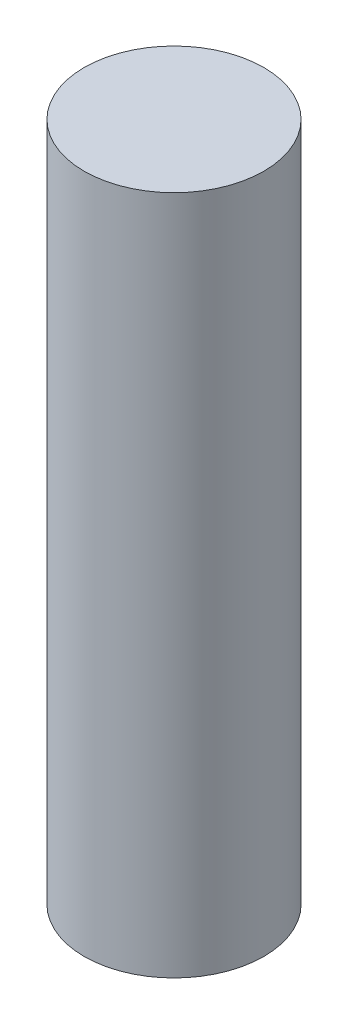
ISO-10303-21;
HEADER;
FILE_DESCRIPTION(('STEP AP214'),'2;1');
FILE_NAME('part.step','',(''),(''),'','','');
FILE_SCHEMA(('AUTOMOTIVE_DESIGN { 1 0 10303 214 1 1 1 1 }'));
ENDSEC;
DATA;
#1=APPLICATION_CONTEXT('core data for automotive mechanical design processes');
#2=APPLICATION_PROTOCOL_DEFINITION('international standard','automotive_design',2000,#1);
#3=PRODUCT_CONTEXT('',#1,'mechanical');
#4=PRODUCT('Part','Part','',(#3));
#5=PRODUCT_RELATED_PRODUCT_CATEGORY('part','',(#4));
#6=PRODUCT_DEFINITION_FORMATION('','',#4);
#7=PRODUCT_DEFINITION_CONTEXT('part definition',#1,'design');
#8=PRODUCT_DEFINITION('design','',#6,#7);
#9=PRODUCT_DEFINITION_SHAPE('','',#8);
#10=(LENGTH_UNIT() NAMED_UNIT(*) SI_UNIT(.MILLI.,.METRE.));
#11=(NAMED_UNIT(*) PLANE_ANGLE_UNIT() SI_UNIT($,.RADIAN.));
#12=(NAMED_UNIT(*) SI_UNIT($,.STERADIAN.) SOLID_ANGLE_UNIT());
#13=UNCERTAINTY_MEASURE_WITH_UNIT(LENGTH_MEASURE(1.E-05),#10,'distance_accuracy_value','');
#14=(GEOMETRIC_REPRESENTATION_CONTEXT(3) GLOBAL_UNCERTAINTY_ASSIGNED_CONTEXT((#13)) GLOBAL_UNIT_ASSIGNED_CONTEXT((#10,
#11,#12)) REPRESENTATION_CONTEXT('',''));
#15=CARTESIAN_POINT('',(0.,0.,0.));
#16=DIRECTION('',(0.,0.,1.));
#17=DIRECTION('',(1.,0.,0.));
#18=AXIS2_PLACEMENT_3D('',#15,#16,#17);
#19=CARTESIAN_POINT('',(0.,95.,0.));
#20=DIRECTION('',(0.,-1.,0.));
#21=DIRECTION('',(0.,0.,-1.));
#22=AXIS2_PLACEMENT_3D('',#19,#20,#21);
#23=CYLINDRICAL_SURFACE('',#22,12.55);
#24=CARTESIAN_POINT('',(0.,95.,0.));
#25=DIRECTION('',(0.,1.,0.));
#26=DIRECTION('',(0.,0.,1.));
#27=AXIS2_PLACEMENT_3D('',#24,#25,#26);
#28=CIRCLE('',#27,12.55);
#29=CARTESIAN_POINT('',(0.,95.,12.55));
#30=VERTEX_POINT('',#29);
#31=EDGE_CURVE('E10',#30,#30,#28,.T.);
#32=ORIENTED_EDGE('',*,*,#31,.F.);
#33=EDGE_LOOP('',(#32));
#34=FACE_BOUND('',#33,.T.);
#35=CARTESIAN_POINT('',(0.,0.,0.));
#36=DIRECTION('',(0.,1.,0.));
#37=DIRECTION('',(0.,0.,1.));
#38=AXIS2_PLACEMENT_3D('',#35,#36,#37);
#39=CIRCLE('',#38,12.55);
#40=CARTESIAN_POINT('',(0.,0.,12.55));
#41=VERTEX_POINT('',#40);
#42=EDGE_CURVE('E34',#41,#41,#39,.T.);
#43=ORIENTED_EDGE('',*,*,#42,.T.);
#44=EDGE_LOOP('',(#43));
#45=FACE_BOUND('',#44,.T.);
#46=ADVANCED_FACE('F31',(#34,#45),#23,.T.);
#47=CARTESIAN_POINT('',(0.,95.,0.));
#48=DIRECTION('',(0.,1.,0.));
#49=DIRECTION('',(0.,0.,1.));
#50=AXIS2_PLACEMENT_3D('',#47,#48,#49);
#51=PLANE('',#50);
#52=ORIENTED_EDGE('',*,*,#31,.T.);
#53=EDGE_LOOP('',(#52));
#54=FACE_BOUND('',#53,.T.);
#55=ADVANCED_FACE('F46',(#54),#51,.T.);
#56=CARTESIAN_POINT('',(0.,0.,0.));
#57=DIRECTION('',(0.,1.,0.));
#58=DIRECTION('',(0.,0.,1.));
#59=AXIS2_PLACEMENT_3D('',#56,#57,#58);
#60=PLANE('',#59);
#61=ORIENTED_EDGE('',*,*,#42,.F.);
#62=EDGE_LOOP('',(#61));
#63=FACE_BOUND('',#62,.T.);
#64=ADVANCED_FACE('F44',(#63),#60,.F.);
#65=CLOSED_SHELL('',(#46,#55,#64));
#66=MANIFOLD_SOLID_BREP('B2',#65);
#67=ADVANCED_BREP_SHAPE_REPRESENTATION('',(#18,#66),#14);
#68=SHAPE_DEFINITION_REPRESENTATION(#9,#67);
ENDSEC;
END-ISO-10303-21;
